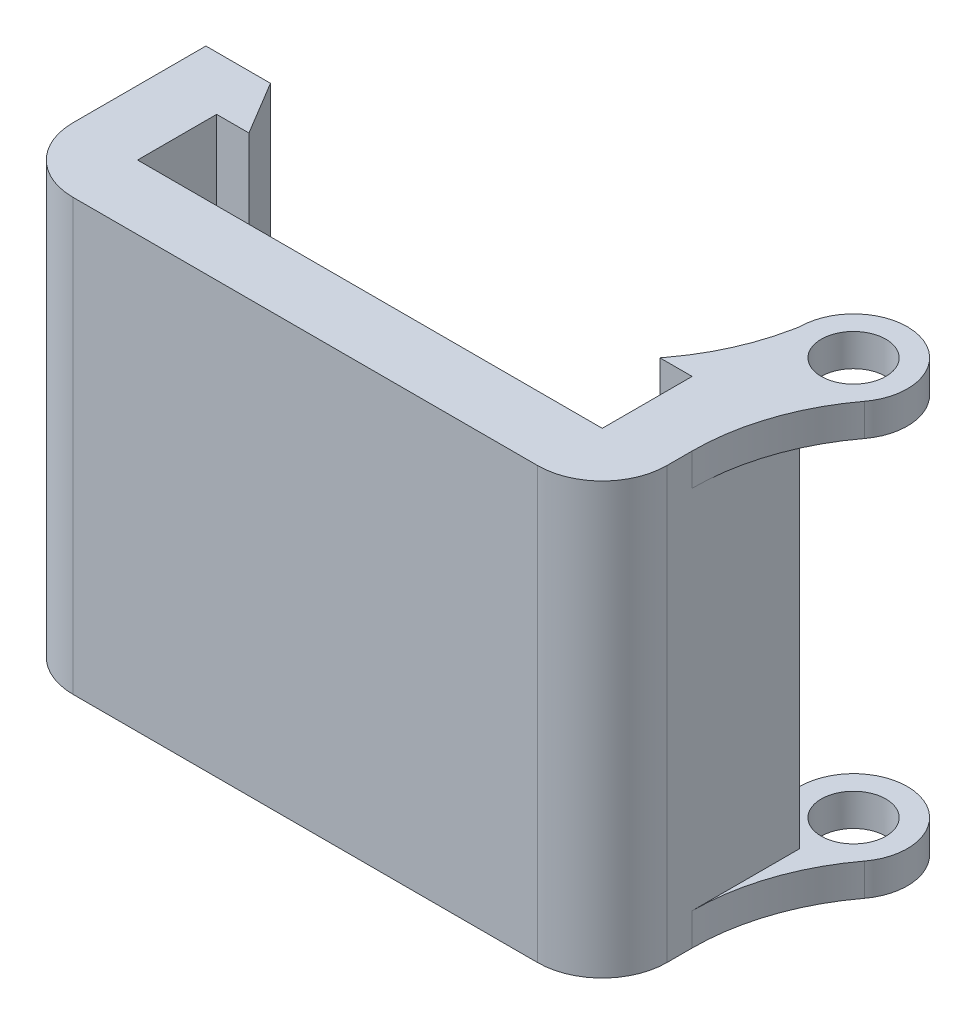
ISO-10303-21;
HEADER;
FILE_DESCRIPTION(('STEP AP214'),'2;1');
FILE_NAME('part.step','',(''),(''),'','','');
FILE_SCHEMA(('AUTOMOTIVE_DESIGN { 1 0 10303 214 1 1 1 1 }'));
ENDSEC;
DATA;
#1=APPLICATION_CONTEXT('core data for automotive mechanical design processes');
#2=APPLICATION_PROTOCOL_DEFINITION('international standard','automotive_design',2000,#1);
#3=PRODUCT_CONTEXT('',#1,'mechanical');
#4=PRODUCT('Part','Part','',(#3));
#5=PRODUCT_RELATED_PRODUCT_CATEGORY('part','',(#4));
#6=PRODUCT_DEFINITION_FORMATION('','',#4);
#7=PRODUCT_DEFINITION_CONTEXT('part definition',#1,'design');
#8=PRODUCT_DEFINITION('design','',#6,#7);
#9=PRODUCT_DEFINITION_SHAPE('','',#8);
#10=(LENGTH_UNIT() NAMED_UNIT(*) SI_UNIT(.MILLI.,.METRE.));
#11=(NAMED_UNIT(*) PLANE_ANGLE_UNIT() SI_UNIT($,.RADIAN.));
#12=(NAMED_UNIT(*) SI_UNIT($,.STERADIAN.) SOLID_ANGLE_UNIT());
#13=UNCERTAINTY_MEASURE_WITH_UNIT(LENGTH_MEASURE(1.E-05),#10,'distance_accuracy_value','');
#14=(GEOMETRIC_REPRESENTATION_CONTEXT(3) GLOBAL_UNCERTAINTY_ASSIGNED_CONTEXT((#13)) GLOBAL_UNIT_ASSIGNED_CONTEXT((#10,
#11,#12)) REPRESENTATION_CONTEXT('',''));
#15=CARTESIAN_POINT('',(0.,0.,0.));
#16=DIRECTION('',(0.,0.,1.));
#17=DIRECTION('',(1.,0.,0.));
#18=AXIS2_PLACEMENT_3D('',#15,#16,#17);
#19=CARTESIAN_POINT('',(0.,0.,18.));
#20=DIRECTION('',(0.,0.,-1.));
#21=DIRECTION('',(0.,1.,0.));
#22=AXIS2_PLACEMENT_3D('',#19,#20,#21);
#23=PLANE('',#22);
#24=DIRECTION('',(0.,1.,0.));
#25=VECTOR('',#24,1.);
#26=CARTESIAN_POINT('',(10.795,75.7846876024438,18.));
#27=LINE('',#26,#25);
#28=CARTESIAN_POINT('',(10.795,57.2846876024437,18.));
#29=VERTEX_POINT('',#28);
#30=CARTESIAN_POINT('',(10.795,74.2846876024438,18.));
#31=VERTEX_POINT('',#30);
#32=EDGE_CURVE('E305',#29,#31,#27,.T.);
#33=ORIENTED_EDGE('',*,*,#32,.T.);
#34=DIRECTION('',(1.,0.,0.));
#35=VECTOR('',#34,1.);
#36=CARTESIAN_POINT('',(10.795,74.2846876024438,18.));
#37=LINE('',#36,#35);
#38=CARTESIAN_POINT('',(13.795,74.2846876024438,18.));
#39=VERTEX_POINT('',#38);
#40=EDGE_CURVE('E214',#31,#39,#37,.T.);
#41=ORIENTED_EDGE('',*,*,#40,.T.);
#42=DIRECTION('',(0.,-1.,0.));
#43=VECTOR('',#42,1.);
#44=CARTESIAN_POINT('',(13.795,75.7846876024438,18.));
#45=LINE('',#44,#43);
#46=CARTESIAN_POINT('',(13.795,57.2846876024437,18.));
#47=VERTEX_POINT('',#46);
#48=EDGE_CURVE('E309',#39,#47,#45,.T.);
#49=ORIENTED_EDGE('',*,*,#48,.T.);
#50=DIRECTION('',(-1.,0.,0.));
#51=VECTOR('',#50,1.);
#52=CARTESIAN_POINT('',(10.795,57.2846876024437,18.));
#53=LINE('',#52,#51);
#54=EDGE_CURVE('E236',#47,#29,#53,.T.);
#55=ORIENTED_EDGE('',*,*,#54,.T.);
#56=EDGE_LOOP('',(#33,#41,#49,#55));
#57=FACE_BOUND('',#56,.T.);
#58=ADVANCED_FACE('F41',(#57),#23,.T.);
#59=CARTESIAN_POINT('',(0.,0.,24.175));
#60=DIRECTION('',(0.,0.,-1.));
#61=DIRECTION('',(-1.,0.,0.));
#62=AXIS2_PLACEMENT_3D('',#59,#60,#61);
#63=PLANE('',#62);
#64=DIRECTION('',(1.,0.,0.));
#65=VECTOR('',#64,1.);
#66=CARTESIAN_POINT('',(-13.795,55.7846876024437,24.175));
#67=LINE('',#66,#65);
#68=CARTESIAN_POINT('',(-10.795,55.7846876024437,24.175));
#69=VERTEX_POINT('',#68);
#70=CARTESIAN_POINT('',(10.795,55.7846876024437,24.175));
#71=VERTEX_POINT('',#70);
#72=EDGE_CURVE('E308',#69,#71,#67,.T.);
#73=ORIENTED_EDGE('',*,*,#72,.F.);
#74=DIRECTION('',(0.,-1.,0.));
#75=VECTOR('',#74,1.);
#76=CARTESIAN_POINT('',(-10.795,75.7846876024438,24.175));
#77=LINE('',#76,#75);
#78=CARTESIAN_POINT('',(-10.795,75.7846876024438,24.175));
#79=VERTEX_POINT('',#78);
#80=EDGE_CURVE('E284',#79,#69,#77,.T.);
#81=ORIENTED_EDGE('',*,*,#80,.F.);
#82=DIRECTION('',(-1.,0.,0.));
#83=VECTOR('',#82,1.);
#84=CARTESIAN_POINT('',(-13.795,75.7846876024438,24.175));
#85=LINE('',#84,#83);
#86=CARTESIAN_POINT('',(10.795,75.7846876024438,24.175));
#87=VERTEX_POINT('',#86);
#88=EDGE_CURVE('E318',#87,#79,#85,.T.);
#89=ORIENTED_EDGE('',*,*,#88,.F.);
#90=DIRECTION('',(0.,1.,0.));
#91=VECTOR('',#90,1.);
#92=CARTESIAN_POINT('',(10.795,75.7846876024438,24.175));
#93=LINE('',#92,#91);
#94=EDGE_CURVE('E301',#71,#87,#93,.T.);
#95=ORIENTED_EDGE('',*,*,#94,.F.);
#96=EDGE_LOOP('',(#73,#81,#89,#95));
#97=FACE_BOUND('',#96,.T.);
#98=ADVANCED_FACE('F429',(#97),#63,.T.);
#99=CARTESIAN_POINT('',(-13.795,55.7846876024437,27.175));
#100=DIRECTION('',(1.,0.,0.));
#101=DIRECTION('',(0.,0.,-1.));
#102=AXIS2_PLACEMENT_3D('',#99,#100,#101);
#103=PLANE('',#102);
#104=DIRECTION('',(0.,0.,-1.));
#105=VECTOR('',#104,1.);
#106=CARTESIAN_POINT('',(-13.795,55.7846876024437,27.175));
#107=LINE('',#106,#105);
#108=CARTESIAN_POINT('',(-13.795,55.7846876024437,24.175));
#109=VERTEX_POINT('',#108);
#110=CARTESIAN_POINT('',(-13.795,55.7846876024437,18.));
#111=VERTEX_POINT('',#110);
#112=EDGE_CURVE('E331',#109,#111,#107,.T.);
#113=ORIENTED_EDGE('',*,*,#112,.F.);
#114=DIRECTION('',(0.,-1.,0.));
#115=VECTOR('',#114,1.);
#116=CARTESIAN_POINT('',(-13.795,55.7846876024437,24.175));
#117=LINE('',#116,#115);
#118=CARTESIAN_POINT('',(-13.795,75.7846876024438,24.175));
#119=VERTEX_POINT('',#118);
#120=EDGE_CURVE('E64',#109,#119,#117,.F.);
#121=ORIENTED_EDGE('',*,*,#120,.T.);
#122=DIRECTION('',(0.,0.,-1.));
#123=VECTOR('',#122,1.);
#124=CARTESIAN_POINT('',(-13.795,75.7846876024438,27.175));
#125=LINE('',#124,#123);
#126=CARTESIAN_POINT('',(-13.795,75.7846876024438,18.));
#127=VERTEX_POINT('',#126);
#128=EDGE_CURVE('E321',#119,#127,#125,.T.);
#129=ORIENTED_EDGE('',*,*,#128,.T.);
#130=DIRECTION('',(0.,1.,0.));
#131=VECTOR('',#130,1.);
#132=CARTESIAN_POINT('',(-13.795,75.7846876024438,18.));
#133=LINE('',#132,#131);
#134=EDGE_CURVE('E291',#111,#127,#133,.T.);
#135=ORIENTED_EDGE('',*,*,#134,.F.);
#136=EDGE_LOOP('',(#113,#121,#129,#135));
#137=FACE_BOUND('',#136,.T.);
#138=ADVANCED_FACE('F408',(#137),#103,.F.);
#139=CARTESIAN_POINT('',(-13.795,55.7846876024437,27.175));
#140=DIRECTION('',(0.,1.,0.));
#141=DIRECTION('',(0.,0.,1.));
#142=AXIS2_PLACEMENT_3D('',#139,#140,#141);
#143=PLANE('',#142);
#144=CARTESIAN_POINT('',(13.795,55.7846876024437,15.5));
#145=DIRECTION('',(0.,1.,0.));
#146=DIRECTION('',(0.,0.,1.));
#147=AXIS2_PLACEMENT_3D('',#144,#145,#146);
#148=CIRCLE('',#147,1.5);
#149=CARTESIAN_POINT('',(13.795,55.7846876024437,17.));
#150=VERTEX_POINT('',#149);
#151=EDGE_CURVE('E337',#150,#150,#148,.F.);
#152=ORIENTED_EDGE('',*,*,#151,.F.);
#153=EDGE_LOOP('',(#152));
#154=FACE_BOUND('',#153,.T.);
#155=DIRECTION('',(1.,0.,0.));
#156=VECTOR('',#155,1.);
#157=CARTESIAN_POINT('',(-13.795,55.7846876024437,27.175));
#158=LINE('',#157,#156);
#159=CARTESIAN_POINT('',(-10.795,55.7846876024437,27.175));
#160=VERTEX_POINT('',#159);
#161=CARTESIAN_POINT('',(10.795,55.7846876024437,27.175));
#162=VERTEX_POINT('',#161);
#163=EDGE_CURVE('E314',#160,#162,#158,.T.);
#164=ORIENTED_EDGE('',*,*,#163,.F.);
#165=CARTESIAN_POINT('',(-10.795,55.7846876024437,24.175));
#166=DIRECTION('',(0.,1.,0.));
#167=DIRECTION('',(0.,0.,1.));
#168=AXIS2_PLACEMENT_3D('',#165,#166,#167);
#169=CIRCLE('',#168,3.);
#170=EDGE_CURVE('E391',#160,#109,#169,.F.);
#171=ORIENTED_EDGE('',*,*,#170,.T.);
#172=ORIENTED_EDGE('',*,*,#112,.T.);
#173=DIRECTION('',(-1.,0.,0.));
#174=VECTOR('',#173,1.);
#175=CARTESIAN_POINT('',(-13.795,55.7846876024437,18.));
#176=LINE('',#175,#174);
#177=CARTESIAN_POINT('',(-10.795,55.7846876024437,18.));
#178=VERTEX_POINT('',#177);
#179=EDGE_CURVE('E285',#178,#111,#176,.T.);
#180=ORIENTED_EDGE('',*,*,#179,.F.);
#181=DIRECTION('',(0.514495755427527,0.,0.857492925712544));
#182=VECTOR('',#181,1.);
#183=CARTESIAN_POINT('',(-10.795,55.7846876024437,18.));
#184=LINE('',#183,#182);
#185=CARTESIAN_POINT('',(-9.295,55.7846876024437,20.5));
#186=VERTEX_POINT('',#185);
#187=EDGE_CURVE('E251',#178,#186,#184,.T.);
#188=ORIENTED_EDGE('',*,*,#187,.T.);
#189=DIRECTION('',(-1.,0.,0.));
#190=VECTOR('',#189,1.);
#191=CARTESIAN_POINT('',(-9.295,55.7846876024437,20.5));
#192=LINE('',#191,#190);
#193=CARTESIAN_POINT('',(-10.795,55.7846876024437,20.5));
#194=VERTEX_POINT('',#193);
#195=EDGE_CURVE('E258',#186,#194,#192,.T.);
#196=ORIENTED_EDGE('',*,*,#195,.T.);
#197=DIRECTION('',(0.,0.,1.));
#198=VECTOR('',#197,1.);
#199=CARTESIAN_POINT('',(-10.795,55.7846876024437,-5.22374841615669));
#200=LINE('',#199,#198);
#201=EDGE_CURVE('E282',#194,#69,#200,.T.);
#202=ORIENTED_EDGE('',*,*,#201,.T.);
#203=ORIENTED_EDGE('',*,*,#72,.T.);
#204=DIRECTION('',(0.,0.,1.));
#205=VECTOR('',#204,1.);
#206=CARTESIAN_POINT('',(10.795,55.7846876024437,-5.22374841615669));
#207=LINE('',#206,#205);
#208=CARTESIAN_POINT('',(10.795,55.7846876024437,20.));
#209=VERTEX_POINT('',#208);
#210=EDGE_CURVE('E288',#209,#71,#207,.T.);
#211=ORIENTED_EDGE('',*,*,#210,.F.);
#212=DIRECTION('',(-1.,0.,0.));
#213=VECTOR('',#212,1.);
#214=CARTESIAN_POINT('',(10.795,55.7846876024437,20.));
#215=LINE('',#214,#213);
#216=CARTESIAN_POINT('',(9.295,55.7846876024437,20.));
#217=VERTEX_POINT('',#216);
#218=EDGE_CURVE('E270',#209,#217,#215,.T.);
#219=ORIENTED_EDGE('',*,*,#218,.T.);
#220=DIRECTION('',(0.6,0.,-0.8));
#221=VECTOR('',#220,1.);
#222=CARTESIAN_POINT('',(9.295,55.7846876024437,20.));
#223=LINE('',#222,#221);
#224=CARTESIAN_POINT('',(9.4340376902015,55.7846876024437,19.8146164130647));
#225=VERTEX_POINT('',#224);
#226=EDGE_CURVE('E267',#217,#225,#223,.T.);
#227=ORIENTED_EDGE('',*,*,#226,.T.);
#228=CARTESIAN_POINT('',(1.4340376902015,55.7846876024437,13.8146164130647));
#229=DIRECTION('',(0.,1.,0.));
#230=DIRECTION('',(0.,0.,1.));
#231=AXIS2_PLACEMENT_3D('',#228,#229,#230);
#232=CIRCLE('',#231,10.);
#233=CARTESIAN_POINT('',(11.2398444471107,55.7846876024437,15.7757777644465));
#234=VERTEX_POINT('',#233);
#235=EDGE_CURVE('E378',#225,#234,#232,.T.);
#236=ORIENTED_EDGE('',*,*,#235,.T.);
#237=DIRECTION('',(0.196116135138183,0.,-0.98058067569092));
#238=VECTOR('',#237,1.);
#239=CARTESIAN_POINT('',(10.795,55.7846876024437,18.));
#240=LINE('',#239,#238);
#241=CARTESIAN_POINT('',(11.295,55.7846876024437,15.5));
#242=VERTEX_POINT('',#241);
#243=EDGE_CURVE('E223',#234,#242,#240,.T.);
#244=ORIENTED_EDGE('',*,*,#243,.T.);
#245=CARTESIAN_POINT('',(13.795,55.7846876024437,15.5));
#246=DIRECTION('',(0.,-1.,0.));
#247=DIRECTION('',(0.,0.,-1.));
#248=AXIS2_PLACEMENT_3D('',#245,#246,#247);
#249=CIRCLE('',#248,2.5);
#250=CARTESIAN_POINT('',(15.795,55.7846876024437,17.));
#251=VERTEX_POINT('',#250);
#252=EDGE_CURVE('E240',#242,#251,#249,.T.);
#253=ORIENTED_EDGE('',*,*,#252,.T.);
#254=CARTESIAN_POINT('',(23.795,55.7846876024437,23.));
#255=DIRECTION('',(0.,1.,0.));
#256=DIRECTION('',(0.,0.,1.));
#257=AXIS2_PLACEMENT_3D('',#254,#255,#256);
#258=CIRCLE('',#257,10.);
#259=CARTESIAN_POINT('',(13.795,55.7846876024437,23.));
#260=VERTEX_POINT('',#259);
#261=EDGE_CURVE('E352',#251,#260,#258,.T.);
#262=ORIENTED_EDGE('',*,*,#261,.T.);
#263=DIRECTION('',(0.,0.,-1.));
#264=VECTOR('',#263,1.);
#265=CARTESIAN_POINT('',(13.795,55.7846876024437,27.175));
#266=LINE('',#265,#264);
#267=CARTESIAN_POINT('',(13.795,55.7846876024437,24.175));
#268=VERTEX_POINT('',#267);
#269=EDGE_CURVE('E329',#268,#260,#266,.T.);
#270=ORIENTED_EDGE('',*,*,#269,.F.);
#271=CARTESIAN_POINT('',(10.795,55.7846876024437,24.175));
#272=DIRECTION('',(0.,1.,0.));
#273=DIRECTION('',(0.,0.,1.));
#274=AXIS2_PLACEMENT_3D('',#271,#272,#273);
#275=CIRCLE('',#274,3.);
#276=EDGE_CURVE('E389',#268,#162,#275,.F.);
#277=ORIENTED_EDGE('',*,*,#276,.T.);
#278=EDGE_LOOP('',(#164,#171,#172,#180,#188,#196,#202,#203,#211,#219,#227,#236,#244,#253,#262,
#270,#277));
#279=FACE_BOUND('',#278,.T.);
#280=ADVANCED_FACE('F405',(#154,#279),#143,.F.);
#281=CARTESIAN_POINT('',(13.795,55.7846876024437,27.175));
#282=DIRECTION('',(-1.,0.,0.));
#283=DIRECTION('',(0.,0.,1.));
#284=AXIS2_PLACEMENT_3D('',#281,#282,#283);
#285=PLANE('',#284);
#286=DIRECTION('',(0.,0.,-1.));
#287=VECTOR('',#286,1.);
#288=CARTESIAN_POINT('',(13.795,75.7846876024438,27.175));
#289=LINE('',#288,#287);
#290=CARTESIAN_POINT('',(13.795,75.7846876024438,24.175));
#291=VERTEX_POINT('',#290);
#292=CARTESIAN_POINT('',(13.795,75.7846876024438,23.));
#293=VERTEX_POINT('',#292);
#294=EDGE_CURVE('E327',#291,#293,#289,.T.);
#295=ORIENTED_EDGE('',*,*,#294,.F.);
#296=DIRECTION('',(0.,1.,0.));
#297=VECTOR('',#296,1.);
#298=CARTESIAN_POINT('',(13.795,55.7846876024437,24.175));
#299=LINE('',#298,#297);
#300=EDGE_CURVE('E11',#291,#268,#299,.F.);
#301=ORIENTED_EDGE('',*,*,#300,.T.);
#302=ORIENTED_EDGE('',*,*,#269,.T.);
#303=DIRECTION('',(0.,-1.,0.));
#304=VECTOR('',#303,1.);
#305=CARTESIAN_POINT('',(13.795,55.7846876024437,23.));
#306=LINE('',#305,#304);
#307=CARTESIAN_POINT('',(13.795,57.2846876024437,23.));
#308=VERTEX_POINT('',#307);
#309=EDGE_CURVE('E348',#260,#308,#306,.F.);
#310=ORIENTED_EDGE('',*,*,#309,.T.);
#311=DIRECTION('',(0.,0.,-1.));
#312=VECTOR('',#311,1.);
#313=CARTESIAN_POINT('',(13.795,57.2846876024437,15.5));
#314=LINE('',#313,#312);
#315=EDGE_CURVE('E346',#308,#47,#314,.T.);
#316=ORIENTED_EDGE('',*,*,#315,.T.);
#317=ORIENTED_EDGE('',*,*,#48,.F.);
#318=DIRECTION('',(0.,0.,1.));
#319=VECTOR('',#318,1.);
#320=CARTESIAN_POINT('',(13.795,74.2846876024438,15.5));
#321=LINE('',#320,#319);
#322=CARTESIAN_POINT('',(13.795,74.2846876024438,23.));
#323=VERTEX_POINT('',#322);
#324=EDGE_CURVE('E343',#39,#323,#321,.T.);
#325=ORIENTED_EDGE('',*,*,#324,.T.);
#326=DIRECTION('',(0.,1.,0.));
#327=VECTOR('',#326,1.);
#328=CARTESIAN_POINT('',(13.795,55.7846876024437,23.));
#329=LINE('',#328,#327);
#330=EDGE_CURVE('E340',#323,#293,#329,.T.);
#331=ORIENTED_EDGE('',*,*,#330,.T.);
#332=EDGE_LOOP('',(#295,#301,#302,#310,#316,#317,#325,#331));
#333=FACE_BOUND('',#332,.T.);
#334=ADVANCED_FACE('F471',(#333),#285,.F.);
#335=CARTESIAN_POINT('',(-13.795,75.7846876024438,27.175));
#336=DIRECTION('',(0.,-1.,0.));
#337=DIRECTION('',(0.,0.,-1.));
#338=AXIS2_PLACEMENT_3D('',#335,#336,#337);
#339=PLANE('',#338);
#340=CARTESIAN_POINT('',(13.795,75.7846876024438,15.5));
#341=DIRECTION('',(0.,1.,0.));
#342=DIRECTION('',(0.,0.,1.));
#343=AXIS2_PLACEMENT_3D('',#340,#341,#342);
#344=CIRCLE('',#343,1.5);
#345=CARTESIAN_POINT('',(13.795,75.7846876024438,17.));
#346=VERTEX_POINT('',#345);
#347=EDGE_CURVE('E484',#346,#346,#344,.T.);
#348=ORIENTED_EDGE('',*,*,#347,.F.);
#349=EDGE_LOOP('',(#348));
#350=FACE_BOUND('',#349,.T.);
#351=ORIENTED_EDGE('',*,*,#128,.F.);
#352=CARTESIAN_POINT('',(-10.795,75.7846876024438,24.175));
#353=DIRECTION('',(0.,-1.,0.));
#354=DIRECTION('',(0.,0.,-1.));
#355=AXIS2_PLACEMENT_3D('',#352,#353,#354);
#356=CIRCLE('',#355,3.);
#357=CARTESIAN_POINT('',(-10.795,75.7846876024438,27.175));
#358=VERTEX_POINT('',#357);
#359=EDGE_CURVE('E49',#119,#358,#356,.F.);
#360=ORIENTED_EDGE('',*,*,#359,.T.);
#361=DIRECTION('',(-1.,0.,0.));
#362=VECTOR('',#361,1.);
#363=CARTESIAN_POINT('',(-13.795,75.7846876024438,27.175));
#364=LINE('',#363,#362);
#365=CARTESIAN_POINT('',(10.795,75.7846876024438,27.175));
#366=VERTEX_POINT('',#365);
#367=EDGE_CURVE('E317',#366,#358,#364,.T.);
#368=ORIENTED_EDGE('',*,*,#367,.F.);
#369=CARTESIAN_POINT('',(10.795,75.7846876024438,24.175));
#370=DIRECTION('',(0.,-1.,0.));
#371=DIRECTION('',(0.,0.,-1.));
#372=AXIS2_PLACEMENT_3D('',#369,#370,#371);
#373=CIRCLE('',#372,3.);
#374=EDGE_CURVE('E56',#366,#291,#373,.F.);
#375=ORIENTED_EDGE('',*,*,#374,.T.);
#376=ORIENTED_EDGE('',*,*,#294,.T.);
#377=CARTESIAN_POINT('',(23.795,75.7846876024438,23.));
#378=DIRECTION('',(0.,-1.,0.));
#379=DIRECTION('',(0.,0.,-1.));
#380=AXIS2_PLACEMENT_3D('',#377,#378,#379);
#381=CIRCLE('',#380,10.);
#382=CARTESIAN_POINT('',(15.795,75.7846876024438,17.));
#383=VERTEX_POINT('',#382);
#384=EDGE_CURVE('E359',#293,#383,#381,.T.);
#385=ORIENTED_EDGE('',*,*,#384,.T.);
#386=CARTESIAN_POINT('',(13.795,75.7846876024438,15.5));
#387=DIRECTION('',(0.,1.,0.));
#388=DIRECTION('',(0.,0.,1.));
#389=AXIS2_PLACEMENT_3D('',#386,#387,#388);
#390=CIRCLE('',#389,2.5);
#391=CARTESIAN_POINT('',(11.295,75.7846876024438,15.5));
#392=VERTEX_POINT('',#391);
#393=EDGE_CURVE('E232',#383,#392,#390,.T.);
#394=ORIENTED_EDGE('',*,*,#393,.T.);
#395=DIRECTION('',(-0.196116135138183,0.,0.98058067569092));
#396=VECTOR('',#395,1.);
#397=CARTESIAN_POINT('',(10.795,75.7846876024438,18.));
#398=LINE('',#397,#396);
#399=CARTESIAN_POINT('',(11.2398444471107,75.7846876024438,15.7757777644465));
#400=VERTEX_POINT('',#399);
#401=EDGE_CURVE('E222',#392,#400,#398,.T.);
#402=ORIENTED_EDGE('',*,*,#401,.T.);
#403=CARTESIAN_POINT('',(1.4340376902015,75.7846876024438,13.8146164130647));
#404=DIRECTION('',(0.,-1.,0.));
#405=DIRECTION('',(0.,0.,-1.));
#406=AXIS2_PLACEMENT_3D('',#403,#404,#405);
#407=CIRCLE('',#406,10.);
#408=CARTESIAN_POINT('',(9.4340376902015,75.7846876024438,19.8146164130647));
#409=VERTEX_POINT('',#408);
#410=EDGE_CURVE('E380',#400,#409,#407,.T.);
#411=ORIENTED_EDGE('',*,*,#410,.T.);
#412=DIRECTION('',(-0.6,0.,0.8));
#413=VECTOR('',#412,1.);
#414=CARTESIAN_POINT('',(9.295,75.7846876024438,20.));
#415=LINE('',#414,#413);
#416=CARTESIAN_POINT('',(9.295,75.7846876024438,20.));
#417=VERTEX_POINT('',#416);
#418=EDGE_CURVE('E264',#409,#417,#415,.T.);
#419=ORIENTED_EDGE('',*,*,#418,.T.);
#420=DIRECTION('',(1.,0.,0.));
#421=VECTOR('',#420,1.);
#422=CARTESIAN_POINT('',(10.795,75.7846876024438,20.));
#423=LINE('',#422,#421);
#424=CARTESIAN_POINT('',(10.795,75.7846876024438,20.));
#425=VERTEX_POINT('',#424);
#426=EDGE_CURVE('E273',#417,#425,#423,.T.);
#427=ORIENTED_EDGE('',*,*,#426,.T.);
#428=DIRECTION('',(0.,0.,1.));
#429=VECTOR('',#428,1.);
#430=CARTESIAN_POINT('',(10.795,75.7846876024438,-5.22374841615669));
#431=LINE('',#430,#429);
#432=EDGE_CURVE('E304',#425,#87,#431,.T.);
#433=ORIENTED_EDGE('',*,*,#432,.T.);
#434=ORIENTED_EDGE('',*,*,#88,.T.);
#435=DIRECTION('',(0.,0.,1.));
#436=VECTOR('',#435,1.);
#437=CARTESIAN_POINT('',(-10.795,75.7846876024438,-5.22374841615669));
#438=LINE('',#437,#436);
#439=CARTESIAN_POINT('',(-10.795,75.7846876024438,20.5));
#440=VERTEX_POINT('',#439);
#441=EDGE_CURVE('E286',#440,#79,#438,.T.);
#442=ORIENTED_EDGE('',*,*,#441,.F.);
#443=DIRECTION('',(1.,0.,0.));
#444=VECTOR('',#443,1.);
#445=CARTESIAN_POINT('',(-9.295,75.7846876024438,20.5));
#446=LINE('',#445,#444);
#447=CARTESIAN_POINT('',(-9.295,75.7846876024438,20.5));
#448=VERTEX_POINT('',#447);
#449=EDGE_CURVE('E255',#440,#448,#446,.T.);
#450=ORIENTED_EDGE('',*,*,#449,.T.);
#451=DIRECTION('',(-0.514495755427527,0.,-0.857492925712544));
#452=VECTOR('',#451,1.);
#453=CARTESIAN_POINT('',(-10.795,75.7846876024438,18.));
#454=LINE('',#453,#452);
#455=CARTESIAN_POINT('',(-10.795,75.7846876024438,18.));
#456=VERTEX_POINT('',#455);
#457=EDGE_CURVE('E261',#448,#456,#454,.T.);
#458=ORIENTED_EDGE('',*,*,#457,.T.);
#459=DIRECTION('',(1.,0.,0.));
#460=VECTOR('',#459,1.);
#461=CARTESIAN_POINT('',(-13.795,75.7846876024438,18.));
#462=LINE('',#461,#460);
#463=EDGE_CURVE('E294',#127,#456,#462,.T.);
#464=ORIENTED_EDGE('',*,*,#463,.F.);
#465=EDGE_LOOP('',(#351,#360,#368,#375,#376,#385,#394,#402,#411,#419,#427,#433,#434,#442,#450,
#458,#464));
#466=FACE_BOUND('',#465,.T.);
#467=ADVANCED_FACE('F395',(#350,#466),#339,.F.);
#468=CARTESIAN_POINT('',(0.,0.,27.175));
#469=DIRECTION('',(0.,0.,-1.));
#470=DIRECTION('',(-1.,0.,0.));
#471=AXIS2_PLACEMENT_3D('',#468,#469,#470);
#472=PLANE('',#471);
#473=ORIENTED_EDGE('',*,*,#367,.T.);
#474=DIRECTION('',(0.,-1.,0.));
#475=VECTOR('',#474,1.);
#476=CARTESIAN_POINT('',(-10.795,0.,27.175));
#477=LINE('',#476,#475);
#478=EDGE_CURVE('E386',#358,#160,#477,.T.);
#479=ORIENTED_EDGE('',*,*,#478,.T.);
#480=ORIENTED_EDGE('',*,*,#163,.T.);
#481=DIRECTION('',(0.,1.,0.));
#482=VECTOR('',#481,1.);
#483=CARTESIAN_POINT('',(10.795,0.,27.175));
#484=LINE('',#483,#482);
#485=EDGE_CURVE('E383',#162,#366,#484,.T.);
#486=ORIENTED_EDGE('',*,*,#485,.T.);
#487=EDGE_LOOP('',(#473,#479,#480,#486));
#488=FACE_BOUND('',#487,.T.);
#489=ADVANCED_FACE('F400',(#488),#472,.F.);
#490=CARTESIAN_POINT('',(10.795,75.7846876024438,-5.22374841615669));
#491=DIRECTION('',(1.,0.,0.));
#492=DIRECTION('',(0.,1.,0.));
#493=AXIS2_PLACEMENT_3D('',#490,#491,#492);
#494=PLANE('',#493);
#495=ORIENTED_EDGE('',*,*,#432,.F.);
#496=DIRECTION('',(0.,1.,0.));
#497=VECTOR('',#496,1.);
#498=CARTESIAN_POINT('',(10.795,52.8692116550211,20.));
#499=LINE('',#498,#497);
#500=EDGE_CURVE('E271',#209,#425,#499,.T.);
#501=ORIENTED_EDGE('',*,*,#500,.F.);
#502=ORIENTED_EDGE('',*,*,#210,.T.);
#503=ORIENTED_EDGE('',*,*,#94,.T.);
#504=EDGE_LOOP('',(#495,#501,#502,#503));
#505=FACE_BOUND('',#504,.T.);
#506=ADVANCED_FACE('F432',(#505),#494,.F.);
#507=CARTESIAN_POINT('',(-10.795,75.7846876024438,-5.22374841615669));
#508=DIRECTION('',(-1.,0.,0.));
#509=DIRECTION('',(0.,-1.,0.));
#510=AXIS2_PLACEMENT_3D('',#507,#508,#509);
#511=PLANE('',#510);
#512=ORIENTED_EDGE('',*,*,#201,.F.);
#513=DIRECTION('',(0.,1.,0.));
#514=VECTOR('',#513,1.);
#515=CARTESIAN_POINT('',(-10.795,52.8692116550211,20.5));
#516=LINE('',#515,#514);
#517=EDGE_CURVE('E252',#194,#440,#516,.T.);
#518=ORIENTED_EDGE('',*,*,#517,.T.);
#519=ORIENTED_EDGE('',*,*,#441,.T.);
#520=ORIENTED_EDGE('',*,*,#80,.T.);
#521=EDGE_LOOP('',(#512,#518,#519,#520));
#522=FACE_BOUND('',#521,.T.);
#523=ADVANCED_FACE('F422',(#522),#511,.F.);
#524=CARTESIAN_POINT('',(0.,0.,18.));
#525=DIRECTION('',(0.,0.,-1.));
#526=DIRECTION('',(0.,1.,0.));
#527=AXIS2_PLACEMENT_3D('',#524,#525,#526);
#528=PLANE('',#527);
#529=ORIENTED_EDGE('',*,*,#179,.T.);
#530=ORIENTED_EDGE('',*,*,#134,.T.);
#531=ORIENTED_EDGE('',*,*,#463,.T.);
#532=DIRECTION('',(0.,-1.,0.));
#533=VECTOR('',#532,1.);
#534=CARTESIAN_POINT('',(-10.795,75.7846876024438,18.));
#535=LINE('',#534,#533);
#536=EDGE_CURVE('E281',#456,#178,#535,.T.);
#537=ORIENTED_EDGE('',*,*,#536,.T.);
#538=EDGE_LOOP('',(#529,#530,#531,#537));
#539=FACE_BOUND('',#538,.T.);
#540=ADVANCED_FACE('F410',(#539),#528,.T.);
#541=CARTESIAN_POINT('',(9.295,52.8692116550211,20.));
#542=DIRECTION('',(-0.8,0.,-0.6));
#543=DIRECTION('',(-0.6,0.,0.8));
#544=AXIS2_PLACEMENT_3D('',#541,#542,#543);
#545=PLANE('',#544);
#546=ORIENTED_EDGE('',*,*,#32,.F.);
#547=DIRECTION('',(-0.6,0.,0.8));
#548=VECTOR('',#547,1.);
#549=CARTESIAN_POINT('',(9.295,57.2846876024437,20.));
#550=LINE('',#549,#548);
#551=CARTESIAN_POINT('',(9.43403769020149,57.2846876024437,19.8146164130647));
#552=VERTEX_POINT('',#551);
#553=EDGE_CURVE('E371',#29,#552,#550,.T.);
#554=ORIENTED_EDGE('',*,*,#553,.T.);
#555=DIRECTION('',(0.,1.,0.));
#556=VECTOR('',#555,1.);
#557=CARTESIAN_POINT('',(9.43403769020149,55.7846876024437,19.8146164130647));
#558=LINE('',#557,#556);
#559=EDGE_CURVE('E369',#552,#225,#558,.F.);
#560=ORIENTED_EDGE('',*,*,#559,.T.);
#561=ORIENTED_EDGE('',*,*,#226,.F.);
#562=DIRECTION('',(0.,1.,0.));
#563=VECTOR('',#562,1.);
#564=CARTESIAN_POINT('',(9.295,52.8692116550211,20.));
#565=LINE('',#564,#563);
#566=EDGE_CURVE('E276',#217,#417,#565,.T.);
#567=ORIENTED_EDGE('',*,*,#566,.T.);
#568=ORIENTED_EDGE('',*,*,#418,.F.);
#569=DIRECTION('',(0.,1.,0.));
#570=VECTOR('',#569,1.);
#571=CARTESIAN_POINT('',(9.43403769020149,74.2846876024438,19.8146164130647));
#572=LINE('',#571,#570);
#573=CARTESIAN_POINT('',(9.43403769020149,74.2846876024438,19.8146164130647));
#574=VERTEX_POINT('',#573);
#575=EDGE_CURVE('E366',#409,#574,#572,.F.);
#576=ORIENTED_EDGE('',*,*,#575,.T.);
#577=DIRECTION('',(0.6,0.,-0.8));
#578=VECTOR('',#577,1.);
#579=CARTESIAN_POINT('',(9.295,74.2846876024438,20.));
#580=LINE('',#579,#578);
#581=EDGE_CURVE('E364',#574,#31,#580,.T.);
#582=ORIENTED_EDGE('',*,*,#581,.T.);
#583=EDGE_LOOP('',(#546,#554,#560,#561,#567,#568,#576,#582));
#584=FACE_BOUND('',#583,.T.);
#585=ADVANCED_FACE('F443',(#584),#545,.T.);
#586=CARTESIAN_POINT('',(10.795,52.8692116550211,20.));
#587=DIRECTION('',(0.,0.,1.));
#588=DIRECTION('',(1.,0.,0.));
#589=AXIS2_PLACEMENT_3D('',#586,#587,#588);
#590=PLANE('',#589);
#591=ORIENTED_EDGE('',*,*,#218,.F.);
#592=ORIENTED_EDGE('',*,*,#500,.T.);
#593=ORIENTED_EDGE('',*,*,#426,.F.);
#594=ORIENTED_EDGE('',*,*,#566,.F.);
#595=EDGE_LOOP('',(#591,#592,#593,#594));
#596=FACE_BOUND('',#595,.T.);
#597=ADVANCED_FACE('F436',(#596),#590,.T.);
#598=CARTESIAN_POINT('',(-10.795,52.8692116550211,18.));
#599=DIRECTION('',(0.857492925712544,0.,-0.514495755427527));
#600=DIRECTION('',(-0.514495755427527,0.,-0.857492925712544));
#601=AXIS2_PLACEMENT_3D('',#598,#599,#600);
#602=PLANE('',#601);
#603=ORIENTED_EDGE('',*,*,#187,.F.);
#604=ORIENTED_EDGE('',*,*,#536,.F.);
#605=ORIENTED_EDGE('',*,*,#457,.F.);
#606=DIRECTION('',(0.,1.,0.));
#607=VECTOR('',#606,1.);
#608=CARTESIAN_POINT('',(-9.295,52.8692116550211,20.5));
#609=LINE('',#608,#607);
#610=EDGE_CURVE('E256',#186,#448,#609,.T.);
#611=ORIENTED_EDGE('',*,*,#610,.F.);
#612=EDGE_LOOP('',(#603,#604,#605,#611));
#613=FACE_BOUND('',#612,.T.);
#614=ADVANCED_FACE('F419',(#613),#602,.T.);
#615=CARTESIAN_POINT('',(-9.295,52.8692116550211,20.5));
#616=DIRECTION('',(0.,0.,1.));
#617=DIRECTION('',(1.,0.,0.));
#618=AXIS2_PLACEMENT_3D('',#615,#616,#617);
#619=PLANE('',#618);
#620=ORIENTED_EDGE('',*,*,#195,.F.);
#621=ORIENTED_EDGE('',*,*,#610,.T.);
#622=ORIENTED_EDGE('',*,*,#449,.F.);
#623=ORIENTED_EDGE('',*,*,#517,.F.);
#624=EDGE_LOOP('',(#620,#621,#622,#623));
#625=FACE_BOUND('',#624,.T.);
#626=ADVANCED_FACE('F416',(#625),#619,.T.);
#627=CARTESIAN_POINT('',(13.795,57.2846876024437,15.5));
#628=DIRECTION('',(0.,-1.,0.));
#629=DIRECTION('',(0.,0.,-1.));
#630=AXIS2_PLACEMENT_3D('',#627,#628,#629);
#631=CYLINDRICAL_SURFACE('',#630,2.5);
#632=CARTESIAN_POINT('',(13.795,57.2846876024437,15.5));
#633=DIRECTION('',(0.,-1.,0.));
#634=DIRECTION('',(0.,0.,-1.));
#635=AXIS2_PLACEMENT_3D('',#632,#633,#634);
#636=CIRCLE('',#635,2.5);
#637=CARTESIAN_POINT('',(11.295,57.2846876024437,15.5));
#638=VERTEX_POINT('',#637);
#639=CARTESIAN_POINT('',(15.795,57.2846876024437,17.));
#640=VERTEX_POINT('',#639);
#641=EDGE_CURVE('E242',#638,#640,#636,.T.);
#642=ORIENTED_EDGE('',*,*,#641,.T.);
#643=DIRECTION('',(0.,-1.,0.));
#644=VECTOR('',#643,1.);
#645=CARTESIAN_POINT('',(15.795,57.2846876024437,17.));
#646=LINE('',#645,#644);
#647=EDGE_CURVE('E333',#640,#251,#646,.T.);
#648=ORIENTED_EDGE('',*,*,#647,.T.);
#649=ORIENTED_EDGE('',*,*,#252,.F.);
#650=DIRECTION('',(0.,-1.,0.));
#651=VECTOR('',#650,1.);
#652=CARTESIAN_POINT('',(11.295,57.2846876024437,15.5));
#653=LINE('',#652,#651);
#654=EDGE_CURVE('E245',#638,#242,#653,.T.);
#655=ORIENTED_EDGE('',*,*,#654,.F.);
#656=EDGE_LOOP('',(#642,#648,#649,#655));
#657=FACE_BOUND('',#656,.T.);
#658=ADVANCED_FACE('F461',(#657),#631,.T.);
#659=CARTESIAN_POINT('',(10.795,57.2846876024437,18.));
#660=DIRECTION('',(-0.98058067569092,0.,-0.196116135138183));
#661=DIRECTION('',(-0.196116135138183,0.,0.98058067569092));
#662=AXIS2_PLACEMENT_3D('',#659,#660,#661);
#663=PLANE('',#662);
#664=ORIENTED_EDGE('',*,*,#243,.F.);
#665=DIRECTION('',(0.,1.,0.));
#666=VECTOR('',#665,1.);
#667=CARTESIAN_POINT('',(11.2398444471107,57.2846876024437,15.7757777644465));
#668=LINE('',#667,#666);
#669=CARTESIAN_POINT('',(11.2398444471107,57.2846876024437,15.7757777644465));
#670=VERTEX_POINT('',#669);
#671=EDGE_CURVE('E361',#234,#670,#668,.T.);
#672=ORIENTED_EDGE('',*,*,#671,.T.);
#673=DIRECTION('',(0.196116135138183,0.,-0.98058067569092));
#674=VECTOR('',#673,1.);
#675=CARTESIAN_POINT('',(10.795,57.2846876024437,18.));
#676=LINE('',#675,#674);
#677=EDGE_CURVE('E239',#670,#638,#676,.T.);
#678=ORIENTED_EDGE('',*,*,#677,.T.);
#679=ORIENTED_EDGE('',*,*,#654,.T.);
#680=EDGE_LOOP('',(#664,#672,#678,#679));
#681=FACE_BOUND('',#680,.T.);
#682=ADVANCED_FACE('F452',(#681),#663,.T.);
#683=CARTESIAN_POINT('',(13.795,57.2846876024437,15.5));
#684=DIRECTION('',(0.,-1.,0.));
#685=DIRECTION('',(0.,0.,-1.));
#686=AXIS2_PLACEMENT_3D('',#683,#684,#685);
#687=PLANE('',#686);
#688=CARTESIAN_POINT('',(13.795,57.2846876024437,15.5));
#689=DIRECTION('',(0.,-1.,0.));
#690=DIRECTION('',(0.,0.,-1.));
#691=AXIS2_PLACEMENT_3D('',#688,#689,#690);
#692=CIRCLE('',#691,1.5);
#693=CARTESIAN_POINT('',(13.795,57.2846876024437,14.));
#694=VERTEX_POINT('',#693);
#695=EDGE_CURVE('E234',#694,#694,#692,.T.);
#696=ORIENTED_EDGE('',*,*,#695,.T.);
#697=EDGE_LOOP('',(#696));
#698=FACE_BOUND('',#697,.T.);
#699=ORIENTED_EDGE('',*,*,#54,.F.);
#700=ORIENTED_EDGE('',*,*,#315,.F.);
#701=CARTESIAN_POINT('',(23.795,57.2846876024437,23.));
#702=DIRECTION('',(0.,-1.,0.));
#703=DIRECTION('',(0.,0.,-1.));
#704=AXIS2_PLACEMENT_3D('',#701,#702,#703);
#705=CIRCLE('',#704,10.);
#706=EDGE_CURVE('E355',#308,#640,#705,.T.);
#707=ORIENTED_EDGE('',*,*,#706,.T.);
#708=ORIENTED_EDGE('',*,*,#641,.F.);
#709=ORIENTED_EDGE('',*,*,#677,.F.);
#710=CARTESIAN_POINT('',(1.4340376902015,57.2846876024437,13.8146164130647));
#711=DIRECTION('',(0.,-1.,0.));
#712=DIRECTION('',(0.,0.,-1.));
#713=AXIS2_PLACEMENT_3D('',#710,#711,#712);
#714=CIRCLE('',#713,10.);
#715=EDGE_CURVE('E376',#670,#552,#714,.T.);
#716=ORIENTED_EDGE('',*,*,#715,.T.);
#717=ORIENTED_EDGE('',*,*,#553,.F.);
#718=EDGE_LOOP('',(#699,#700,#707,#708,#709,#716,#717));
#719=FACE_BOUND('',#718,.T.);
#720=ADVANCED_FACE('F457',(#698,#719),#687,.F.);
#721=CARTESIAN_POINT('',(10.795,74.2846876024438,18.));
#722=DIRECTION('',(-0.98058067569092,0.,-0.196116135138183));
#723=DIRECTION('',(-0.196116135138183,0.,0.98058067569092));
#724=AXIS2_PLACEMENT_3D('',#721,#722,#723);
#725=PLANE('',#724);
#726=DIRECTION('',(-0.196116135138183,0.,0.98058067569092));
#727=VECTOR('',#726,1.);
#728=CARTESIAN_POINT('',(10.795,74.2846876024438,18.));
#729=LINE('',#728,#727);
#730=CARTESIAN_POINT('',(11.295,74.2846876024438,15.5));
#731=VERTEX_POINT('',#730);
#732=CARTESIAN_POINT('',(11.2398444471107,74.2846876024438,15.7757777644465));
#733=VERTEX_POINT('',#732);
#734=EDGE_CURVE('E213',#731,#733,#729,.T.);
#735=ORIENTED_EDGE('',*,*,#734,.T.);
#736=DIRECTION('',(0.,1.,0.));
#737=VECTOR('',#736,1.);
#738=CARTESIAN_POINT('',(11.2398444471107,75.7846876024438,15.7757777644465));
#739=LINE('',#738,#737);
#740=EDGE_CURVE('E374',#733,#400,#739,.T.);
#741=ORIENTED_EDGE('',*,*,#740,.T.);
#742=ORIENTED_EDGE('',*,*,#401,.F.);
#743=DIRECTION('',(0.,1.,0.));
#744=VECTOR('',#743,1.);
#745=CARTESIAN_POINT('',(11.295,74.2846876024438,15.5));
#746=LINE('',#745,#744);
#747=EDGE_CURVE('E207',#731,#392,#746,.T.);
#748=ORIENTED_EDGE('',*,*,#747,.F.);
#749=EDGE_LOOP('',(#735,#741,#742,#748));
#750=FACE_BOUND('',#749,.T.);
#751=ADVANCED_FACE('F218',(#750),#725,.T.);
#752=CARTESIAN_POINT('',(13.795,74.2846876024438,15.5));
#753=DIRECTION('',(0.,1.,0.));
#754=DIRECTION('',(0.,0.,1.));
#755=AXIS2_PLACEMENT_3D('',#752,#753,#754);
#756=CYLINDRICAL_SURFACE('',#755,2.5);
#757=ORIENTED_EDGE('',*,*,#393,.F.);
#758=DIRECTION('',(0.,1.,0.));
#759=VECTOR('',#758,1.);
#760=CARTESIAN_POINT('',(15.795,74.2846876024438,17.));
#761=LINE('',#760,#759);
#762=CARTESIAN_POINT('',(15.795,74.2846876024438,17.));
#763=VERTEX_POINT('',#762);
#764=EDGE_CURVE('E210',#383,#763,#761,.F.);
#765=ORIENTED_EDGE('',*,*,#764,.T.);
#766=CARTESIAN_POINT('',(13.795,74.2846876024438,15.5));
#767=DIRECTION('',(0.,1.,0.));
#768=DIRECTION('',(0.,0.,1.));
#769=AXIS2_PLACEMENT_3D('',#766,#767,#768);
#770=CIRCLE('',#769,2.5);
#771=EDGE_CURVE('E203',#763,#731,#770,.T.);
#772=ORIENTED_EDGE('',*,*,#771,.T.);
#773=ORIENTED_EDGE('',*,*,#747,.T.);
#774=EDGE_LOOP('',(#757,#765,#772,#773));
#775=FACE_BOUND('',#774,.T.);
#776=ADVANCED_FACE('F206',(#775),#756,.T.);
#777=CARTESIAN_POINT('',(13.795,74.2846876024438,15.5));
#778=DIRECTION('',(0.,1.,0.));
#779=DIRECTION('',(0.,0.,1.));
#780=AXIS2_PLACEMENT_3D('',#777,#778,#779);
#781=PLANE('',#780);
#782=CARTESIAN_POINT('',(13.795,74.2846876024438,15.5));
#783=DIRECTION('',(0.,1.,0.));
#784=DIRECTION('',(0.,0.,1.));
#785=AXIS2_PLACEMENT_3D('',#782,#783,#784);
#786=CIRCLE('',#785,1.5);
#787=CARTESIAN_POINT('',(13.795,74.2846876024438,17.));
#788=VERTEX_POINT('',#787);
#789=EDGE_CURVE('E334',#788,#788,#786,.T.);
#790=ORIENTED_EDGE('',*,*,#789,.T.);
#791=EDGE_LOOP('',(#790));
#792=FACE_BOUND('',#791,.T.);
#793=ORIENTED_EDGE('',*,*,#40,.F.);
#794=ORIENTED_EDGE('',*,*,#581,.F.);
#795=CARTESIAN_POINT('',(1.4340376902015,74.2846876024438,13.8146164130647));
#796=DIRECTION('',(0.,1.,0.));
#797=DIRECTION('',(0.,0.,1.));
#798=AXIS2_PLACEMENT_3D('',#795,#796,#797);
#799=CIRCLE('',#798,10.);
#800=EDGE_CURVE('E228',#574,#733,#799,.T.);
#801=ORIENTED_EDGE('',*,*,#800,.T.);
#802=ORIENTED_EDGE('',*,*,#734,.F.);
#803=ORIENTED_EDGE('',*,*,#771,.F.);
#804=CARTESIAN_POINT('',(23.795,74.2846876024438,23.));
#805=DIRECTION('',(0.,1.,0.));
#806=DIRECTION('',(0.,0.,1.));
#807=AXIS2_PLACEMENT_3D('',#804,#805,#806);
#808=CIRCLE('',#807,10.);
#809=EDGE_CURVE('E357',#763,#323,#808,.T.);
#810=ORIENTED_EDGE('',*,*,#809,.T.);
#811=ORIENTED_EDGE('',*,*,#324,.F.);
#812=EDGE_LOOP('',(#793,#794,#801,#802,#803,#810,#811));
#813=FACE_BOUND('',#812,.T.);
#814=ADVANCED_FACE('F226',(#792,#813),#781,.F.);
#815=CARTESIAN_POINT('',(13.795,51.5420469153244,15.5));
#816=DIRECTION('',(0.,1.,0.));
#817=DIRECTION('',(0.,0.,1.));
#818=AXIS2_PLACEMENT_3D('',#815,#816,#817);
#819=CYLINDRICAL_SURFACE('',#818,1.5);
#820=ORIENTED_EDGE('',*,*,#347,.T.);
#821=EDGE_LOOP('',(#820));
#822=FACE_BOUND('',#821,.T.);
#823=ORIENTED_EDGE('',*,*,#789,.F.);
#824=EDGE_LOOP('',(#823));
#825=FACE_BOUND('',#824,.T.);
#826=ADVANCED_FACE('F488',(#822,#825),#819,.F.);
#827=ORIENTED_EDGE('',*,*,#151,.T.);
#828=EDGE_LOOP('',(#827));
#829=FACE_BOUND('',#828,.T.);
#830=ORIENTED_EDGE('',*,*,#695,.F.);
#831=EDGE_LOOP('',(#830));
#832=FACE_BOUND('',#831,.T.);
#833=ADVANCED_FACE('F534',(#829,#832),#819,.F.);
#834=CARTESIAN_POINT('',(23.795,57.2846876024437,23.));
#835=DIRECTION('',(0.,-1.,0.));
#836=DIRECTION('',(0.,0.,-1.));
#837=AXIS2_PLACEMENT_3D('',#834,#835,#836);
#838=CYLINDRICAL_SURFACE('',#837,10.);
#839=ORIENTED_EDGE('',*,*,#706,.F.);
#840=ORIENTED_EDGE('',*,*,#309,.F.);
#841=ORIENTED_EDGE('',*,*,#261,.F.);
#842=ORIENTED_EDGE('',*,*,#647,.F.);
#843=EDGE_LOOP('',(#839,#840,#841,#842));
#844=FACE_BOUND('',#843,.T.);
#845=ADVANCED_FACE('F464',(#844),#838,.F.);
#846=CARTESIAN_POINT('',(23.795,74.2846876024438,23.));
#847=DIRECTION('',(0.,1.,0.));
#848=DIRECTION('',(0.,0.,1.));
#849=AXIS2_PLACEMENT_3D('',#846,#847,#848);
#850=CYLINDRICAL_SURFACE('',#849,10.);
#851=ORIENTED_EDGE('',*,*,#384,.F.);
#852=ORIENTED_EDGE('',*,*,#330,.F.);
#853=ORIENTED_EDGE('',*,*,#809,.F.);
#854=ORIENTED_EDGE('',*,*,#764,.F.);
#855=EDGE_LOOP('',(#851,#852,#853,#854));
#856=FACE_BOUND('',#855,.T.);
#857=ADVANCED_FACE('F475',(#856),#850,.F.);
#858=CARTESIAN_POINT('',(1.4340376902015,57.2846876024437,13.8146164130647));
#859=DIRECTION('',(0.,-1.,0.));
#860=DIRECTION('',(0.,0.,-1.));
#861=AXIS2_PLACEMENT_3D('',#858,#859,#860);
#862=CYLINDRICAL_SURFACE('',#861,10.);
#863=ORIENTED_EDGE('',*,*,#235,.F.);
#864=ORIENTED_EDGE('',*,*,#559,.F.);
#865=ORIENTED_EDGE('',*,*,#715,.F.);
#866=ORIENTED_EDGE('',*,*,#671,.F.);
#867=EDGE_LOOP('',(#863,#864,#865,#866));
#868=FACE_BOUND('',#867,.T.);
#869=ADVANCED_FACE('F449',(#868),#862,.F.);
#870=CARTESIAN_POINT('',(1.4340376902015,74.2846876024438,13.8146164130647));
#871=DIRECTION('',(0.,-1.,0.));
#872=DIRECTION('',(0.,0.,-1.));
#873=AXIS2_PLACEMENT_3D('',#870,#871,#872);
#874=CYLINDRICAL_SURFACE('',#873,10.);
#875=ORIENTED_EDGE('',*,*,#800,.F.);
#876=ORIENTED_EDGE('',*,*,#575,.F.);
#877=ORIENTED_EDGE('',*,*,#410,.F.);
#878=ORIENTED_EDGE('',*,*,#740,.F.);
#879=EDGE_LOOP('',(#875,#876,#877,#878));
#880=FACE_BOUND('',#879,.T.);
#881=ADVANCED_FACE('F557',(#880),#874,.F.);
#882=CARTESIAN_POINT('',(-10.795,0.,24.175));
#883=DIRECTION('',(0.,-1.,0.));
#884=DIRECTION('',(0.,0.,-1.));
#885=AXIS2_PLACEMENT_3D('',#882,#883,#884);
#886=CYLINDRICAL_SURFACE('',#885,3.);
#887=ORIENTED_EDGE('',*,*,#359,.F.);
#888=ORIENTED_EDGE('',*,*,#120,.F.);
#889=ORIENTED_EDGE('',*,*,#170,.F.);
#890=ORIENTED_EDGE('',*,*,#478,.F.);
#891=EDGE_LOOP('',(#887,#888,#889,#890));
#892=FACE_BOUND('',#891,.T.);
#893=ADVANCED_FACE('F403',(#892),#886,.T.);
#894=CARTESIAN_POINT('',(10.795,0.,24.175));
#895=DIRECTION('',(0.,1.,0.));
#896=DIRECTION('',(0.,0.,1.));
#897=AXIS2_PLACEMENT_3D('',#894,#895,#896);
#898=CYLINDRICAL_SURFACE('',#897,3.);
#899=ORIENTED_EDGE('',*,*,#276,.F.);
#900=ORIENTED_EDGE('',*,*,#300,.F.);
#901=ORIENTED_EDGE('',*,*,#374,.F.);
#902=ORIENTED_EDGE('',*,*,#485,.F.);
#903=EDGE_LOOP('',(#899,#900,#901,#902));
#904=FACE_BOUND('',#903,.T.);
#905=ADVANCED_FACE('F43',(#904),#898,.T.);
#906=CLOSED_SHELL('',(#58,#98,#138,#280,#334,#467,#489,#506,#523,#540,#585,#597,#614,#626,#658,
#682,#720,#751,#776,#814,#826,#833,#845,#857,#869,#881,#893,#905));
#907=MANIFOLD_SOLID_BREP('B2',#906);
#908=ADVANCED_BREP_SHAPE_REPRESENTATION('',(#18,#907),#14);
#909=SHAPE_DEFINITION_REPRESENTATION(#9,#908);
ENDSEC;
END-ISO-10303-21;
